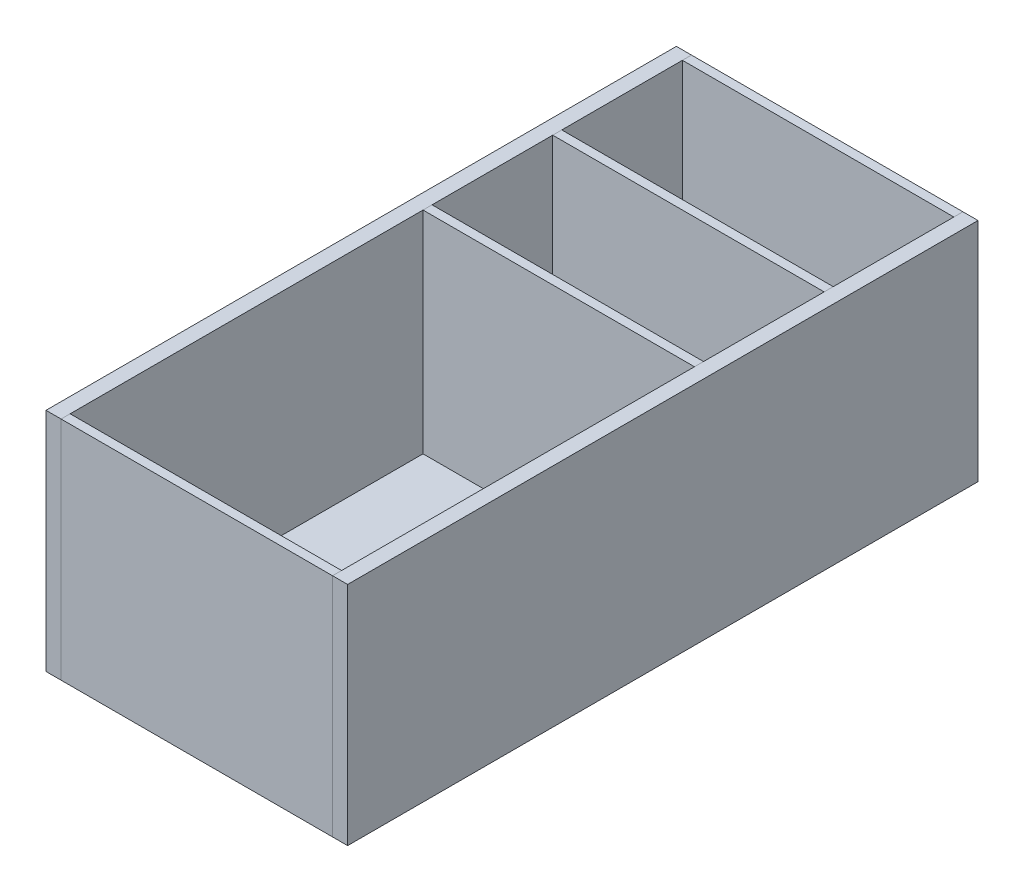
ISO-10303-21;
HEADER;
FILE_DESCRIPTION(('STEP AP214'),'2;1');
FILE_NAME('part.step','',(''),(''),'','','');
FILE_SCHEMA(('AUTOMOTIVE_DESIGN { 1 0 10303 214 1 1 1 1 }'));
ENDSEC;
DATA;
#1=APPLICATION_CONTEXT('core data for automotive mechanical design processes');
#2=APPLICATION_PROTOCOL_DEFINITION('international standard','automotive_design',2000,#1);
#3=PRODUCT_CONTEXT('',#1,'mechanical');
#4=PRODUCT('Part','Part','',(#3));
#5=PRODUCT_RELATED_PRODUCT_CATEGORY('part','',(#4));
#6=PRODUCT_DEFINITION_FORMATION('','',#4);
#7=PRODUCT_DEFINITION_CONTEXT('part definition',#1,'design');
#8=PRODUCT_DEFINITION('design','',#6,#7);
#9=PRODUCT_DEFINITION_SHAPE('','',#8);
#10=(LENGTH_UNIT() NAMED_UNIT(*) SI_UNIT(.MILLI.,.METRE.));
#11=(NAMED_UNIT(*) PLANE_ANGLE_UNIT() SI_UNIT($,.RADIAN.));
#12=(NAMED_UNIT(*) SI_UNIT($,.STERADIAN.) SOLID_ANGLE_UNIT());
#13=UNCERTAINTY_MEASURE_WITH_UNIT(LENGTH_MEASURE(1.E-05),#10,'distance_accuracy_value','');
#14=(GEOMETRIC_REPRESENTATION_CONTEXT(3) GLOBAL_UNCERTAINTY_ASSIGNED_CONTEXT((#13)) GLOBAL_UNIT_ASSIGNED_CONTEXT((#10,
#11,#12)) REPRESENTATION_CONTEXT('',''));
#15=CARTESIAN_POINT('',(0.,0.,0.));
#16=DIRECTION('',(0.,0.,1.));
#17=DIRECTION('',(1.,0.,0.));
#18=AXIS2_PLACEMENT_3D('',#15,#16,#17);
#19=CARTESIAN_POINT('',(-45.,0.,0.));
#20=DIRECTION('',(1.,0.,0.));
#21=DIRECTION('',(0.,0.,-1.));
#22=AXIS2_PLACEMENT_3D('',#19,#20,#21);
#23=PLANE('',#22);
#24=DIRECTION('',(0.,0.,-1.));
#25=VECTOR('',#24,1.);
#26=CARTESIAN_POINT('',(-45.,35.,288.));
#27=LINE('',#26,#25);
#28=CARTESIAN_POINT('',(-45.,35.,166.));
#29=VERTEX_POINT('',#28);
#30=CARTESIAN_POINT('',(-45.,35.,-43.));
#31=VERTEX_POINT('',#30);
#32=EDGE_CURVE('E104',#29,#31,#27,.T.);
#33=ORIENTED_EDGE('',*,*,#32,.F.);
#34=DIRECTION('',(0.,1.,0.));
#35=VECTOR('',#34,1.);
#36=CARTESIAN_POINT('',(-45.,0.,166.));
#37=LINE('',#36,#35);
#38=CARTESIAN_POINT('',(-45.,-40.,166.));
#39=VERTEX_POINT('',#38);
#40=EDGE_CURVE('E63',#39,#29,#37,.T.);
#41=ORIENTED_EDGE('',*,*,#40,.F.);
#42=DIRECTION('',(0.,0.,1.));
#43=VECTOR('',#42,1.);
#44=CARTESIAN_POINT('',(-45.,-40.,288.));
#45=LINE('',#44,#43);
#46=CARTESIAN_POINT('',(-45.,-40.,-43.));
#47=VERTEX_POINT('',#46);
#48=EDGE_CURVE('E115',#47,#39,#45,.T.);
#49=ORIENTED_EDGE('',*,*,#48,.F.);
#50=DIRECTION('',(0.,-1.,0.));
#51=VECTOR('',#50,1.);
#52=CARTESIAN_POINT('',(-45.,0.,-43.));
#53=LINE('',#52,#51);
#54=EDGE_CURVE('E113',#31,#47,#53,.T.);
#55=ORIENTED_EDGE('',*,*,#54,.F.);
#56=EDGE_LOOP('',(#33,#41,#49,#55));
#57=FACE_BOUND('',#56,.T.);
#58=ADVANCED_FACE('F59',(#57),#23,.T.);
#59=CARTESIAN_POINT('',(-50.,0.,288.));
#60=DIRECTION('',(-1.,0.,0.));
#61=DIRECTION('',(0.,0.,1.));
#62=AXIS2_PLACEMENT_3D('',#59,#60,#61);
#63=PLANE('',#62);
#64=DIRECTION('',(0.,0.,-1.));
#65=VECTOR('',#64,1.);
#66=CARTESIAN_POINT('',(-50.,-40.,288.));
#67=LINE('',#66,#65);
#68=CARTESIAN_POINT('',(-50.,-40.,166.));
#69=VERTEX_POINT('',#68);
#70=CARTESIAN_POINT('',(-50.,-40.,-43.));
#71=VERTEX_POINT('',#70);
#72=EDGE_CURVE('E76',#69,#71,#67,.T.);
#73=ORIENTED_EDGE('',*,*,#72,.F.);
#74=DIRECTION('',(0.,-1.,0.));
#75=VECTOR('',#74,1.);
#76=CARTESIAN_POINT('',(-50.,35.,166.));
#77=LINE('',#76,#75);
#78=CARTESIAN_POINT('',(-50.,35.,166.));
#79=VERTEX_POINT('',#78);
#80=EDGE_CURVE('E13',#79,#69,#77,.T.);
#81=ORIENTED_EDGE('',*,*,#80,.F.);
#82=DIRECTION('',(0.,0.,-1.));
#83=VECTOR('',#82,1.);
#84=CARTESIAN_POINT('',(-50.,35.,288.));
#85=LINE('',#84,#83);
#86=CARTESIAN_POINT('',(-50.,35.,-43.));
#87=VERTEX_POINT('',#86);
#88=EDGE_CURVE('E110',#79,#87,#85,.T.);
#89=ORIENTED_EDGE('',*,*,#88,.T.);
#90=DIRECTION('',(0.,1.,0.));
#91=VECTOR('',#90,1.);
#92=CARTESIAN_POINT('',(-50.,35.,-43.));
#93=LINE('',#92,#91);
#94=EDGE_CURVE('E119',#71,#87,#93,.T.);
#95=ORIENTED_EDGE('',*,*,#94,.F.);
#96=EDGE_LOOP('',(#73,#81,#89,#95));
#97=FACE_BOUND('',#96,.T.);
#98=ADVANCED_FACE('F133',(#97),#63,.T.);
#99=CARTESIAN_POINT('',(0.,35.,288.));
#100=DIRECTION('',(0.,1.,0.));
#101=DIRECTION('',(0.,0.,1.));
#102=AXIS2_PLACEMENT_3D('',#99,#100,#101);
#103=PLANE('',#102);
#104=DIRECTION('',(-1.,0.,0.));
#105=VECTOR('',#104,1.);
#106=CARTESIAN_POINT('',(-50.,35.,166.));
#107=LINE('',#106,#105);
#108=EDGE_CURVE('E83',#29,#79,#107,.T.);
#109=ORIENTED_EDGE('',*,*,#108,.F.);
#110=ORIENTED_EDGE('',*,*,#32,.T.);
#111=DIRECTION('',(1.,0.,0.));
#112=VECTOR('',#111,1.);
#113=CARTESIAN_POINT('',(50.,35.,-43.));
#114=LINE('',#113,#112);
#115=EDGE_CURVE('E108',#87,#31,#114,.T.);
#116=ORIENTED_EDGE('',*,*,#115,.F.);
#117=ORIENTED_EDGE('',*,*,#88,.F.);
#118=EDGE_LOOP('',(#109,#110,#116,#117));
#119=FACE_BOUND('',#118,.T.);
#120=ADVANCED_FACE('F106',(#119),#103,.T.);
#121=CARTESIAN_POINT('',(0.,-40.,288.));
#122=DIRECTION('',(0.,-1.,0.));
#123=DIRECTION('',(0.,0.,-1.));
#124=AXIS2_PLACEMENT_3D('',#121,#122,#123);
#125=PLANE('',#124);
#126=DIRECTION('',(-1.,0.,0.));
#127=VECTOR('',#126,1.);
#128=CARTESIAN_POINT('',(50.,-40.,-43.));
#129=LINE('',#128,#127);
#130=EDGE_CURVE('E121',#47,#71,#129,.T.);
#131=ORIENTED_EDGE('',*,*,#130,.F.);
#132=ORIENTED_EDGE('',*,*,#48,.T.);
#133=DIRECTION('',(1.,0.,0.));
#134=VECTOR('',#133,1.);
#135=CARTESIAN_POINT('',(-50.,-40.,166.));
#136=LINE('',#135,#134);
#137=EDGE_CURVE('E68',#69,#39,#136,.T.);
#138=ORIENTED_EDGE('',*,*,#137,.F.);
#139=ORIENTED_EDGE('',*,*,#72,.T.);
#140=EDGE_LOOP('',(#131,#132,#138,#139));
#141=FACE_BOUND('',#140,.T.);
#142=ADVANCED_FACE('F128',(#141),#125,.T.);
#143=CARTESIAN_POINT('',(0.,0.,166.));
#144=DIRECTION('',(0.,0.,1.));
#145=DIRECTION('',(1.,0.,0.));
#146=AXIS2_PLACEMENT_3D('',#143,#144,#145);
#147=PLANE('',#146);
#148=ORIENTED_EDGE('',*,*,#137,.T.);
#149=ORIENTED_EDGE('',*,*,#40,.T.);
#150=ORIENTED_EDGE('',*,*,#108,.T.);
#151=ORIENTED_EDGE('',*,*,#80,.T.);
#152=EDGE_LOOP('',(#148,#149,#150,#151));
#153=FACE_BOUND('',#152,.T.);
#154=ADVANCED_FACE('F129',(#153),#147,.T.);
#155=CARTESIAN_POINT('',(0.,0.,-43.));
#156=DIRECTION('',(0.,0.,-1.));
#157=DIRECTION('',(-1.,0.,0.));
#158=AXIS2_PLACEMENT_3D('',#155,#156,#157);
#159=PLANE('',#158);
#160=ORIENTED_EDGE('',*,*,#115,.T.);
#161=ORIENTED_EDGE('',*,*,#54,.T.);
#162=ORIENTED_EDGE('',*,*,#130,.T.);
#163=ORIENTED_EDGE('',*,*,#94,.T.);
#164=EDGE_LOOP('',(#160,#161,#162,#163));
#165=FACE_BOUND('',#164,.T.);
#166=ADVANCED_FACE('F61',(#165),#159,.T.);
#167=CLOSED_SHELL('',(#58,#98,#120,#142,#154,#166));
#168=MANIFOLD_SOLID_BREP('B2',#167);
#169=CARTESIAN_POINT('',(-45.,0.,0.));
#170=DIRECTION('',(1.,0.,0.));
#171=DIRECTION('',(0.,0.,-1.));
#172=AXIS2_PLACEMENT_3D('',#169,#170,#171);
#173=PLANE('',#172);
#174=DIRECTION('',(0.,0.,-1.));
#175=VECTOR('',#174,1.);
#176=CARTESIAN_POINT('',(-45.,35.,288.));
#177=LINE('',#176,#175);
#178=CARTESIAN_POINT('',(-45.,35.,166.));
#179=VERTEX_POINT('',#178);
#180=CARTESIAN_POINT('',(-45.,35.,163.));
#181=VERTEX_POINT('',#180);
#182=EDGE_CURVE('E414',#179,#181,#177,.T.);
#183=ORIENTED_EDGE('',*,*,#182,.T.);
#184=DIRECTION('',(0.,1.,0.));
#185=VECTOR('',#184,1.);
#186=CARTESIAN_POINT('',(-45.,0.,163.));
#187=LINE('',#186,#185);
#188=CARTESIAN_POINT('',(-45.,-35.,163.));
#189=VERTEX_POINT('',#188);
#190=EDGE_CURVE('E238',#189,#181,#187,.T.);
#191=ORIENTED_EDGE('',*,*,#190,.F.);
#192=DIRECTION('',(0.,0.,-1.));
#193=VECTOR('',#192,1.);
#194=CARTESIAN_POINT('',(-45.,-35.,288.));
#195=LINE('',#194,#193);
#196=CARTESIAN_POINT('',(-45.,-35.,46.));
#197=VERTEX_POINT('',#196);
#198=EDGE_CURVE('E399',#189,#197,#195,.T.);
#199=ORIENTED_EDGE('',*,*,#198,.T.);
#200=DIRECTION('',(0.,-1.,0.));
#201=VECTOR('',#200,1.);
#202=CARTESIAN_POINT('',(-45.,35.,46.));
#203=LINE('',#202,#201);
#204=CARTESIAN_POINT('',(-45.,35.,46.));
#205=VERTEX_POINT('',#204);
#206=EDGE_CURVE('E372',#205,#197,#203,.T.);
#207=ORIENTED_EDGE('',*,*,#206,.F.);
#208=CARTESIAN_POINT('',(-45.,35.,43.));
#209=VERTEX_POINT('',#208);
#210=EDGE_CURVE('E475',#205,#209,#177,.T.);
#211=ORIENTED_EDGE('',*,*,#210,.T.);
#212=DIRECTION('',(0.,-1.,0.));
#213=VECTOR('',#212,1.);
#214=CARTESIAN_POINT('',(-45.,35.,43.));
#215=LINE('',#214,#213);
#216=CARTESIAN_POINT('',(-45.,-35.,43.));
#217=VERTEX_POINT('',#216);
#218=EDGE_CURVE('E225',#209,#217,#215,.T.);
#219=ORIENTED_EDGE('',*,*,#218,.T.);
#220=CARTESIAN_POINT('',(-45.,-35.,3.));
#221=VERTEX_POINT('',#220);
#222=EDGE_CURVE('E421',#217,#221,#195,.T.);
#223=ORIENTED_EDGE('',*,*,#222,.T.);
#224=DIRECTION('',(0.,1.,0.));
#225=VECTOR('',#224,1.);
#226=CARTESIAN_POINT('',(-45.,0.,3.));
#227=LINE('',#226,#225);
#228=CARTESIAN_POINT('',(-45.,35.,3.));
#229=VERTEX_POINT('',#228);
#230=EDGE_CURVE('E405',#221,#229,#227,.T.);
#231=ORIENTED_EDGE('',*,*,#230,.T.);
#232=CARTESIAN_POINT('',(-45.,35.,0.));
#233=VERTEX_POINT('',#232);
#234=EDGE_CURVE('E413',#229,#233,#177,.T.);
#235=ORIENTED_EDGE('',*,*,#234,.T.);
#236=DIRECTION('',(0.,1.,0.));
#237=VECTOR('',#236,1.);
#238=CARTESIAN_POINT('',(-45.,0.,0.));
#239=LINE('',#238,#237);
#240=CARTESIAN_POINT('',(-45.,-35.,0.));
#241=VERTEX_POINT('',#240);
#242=EDGE_CURVE('E446',#241,#233,#239,.T.);
#243=ORIENTED_EDGE('',*,*,#242,.F.);
#244=CARTESIAN_POINT('',(-45.,-35.,-40.));
#245=VERTEX_POINT('',#244);
#246=EDGE_CURVE('E401',#241,#245,#195,.T.);
#247=ORIENTED_EDGE('',*,*,#246,.T.);
#248=DIRECTION('',(0.,-1.,0.));
#249=VECTOR('',#248,1.);
#250=CARTESIAN_POINT('',(-45.,0.,-40.));
#251=LINE('',#250,#249);
#252=CARTESIAN_POINT('',(-45.,35.,-40.));
#253=VERTEX_POINT('',#252);
#254=EDGE_CURVE('E439',#253,#245,#251,.T.);
#255=ORIENTED_EDGE('',*,*,#254,.F.);
#256=CARTESIAN_POINT('',(-45.,35.,-43.));
#257=VERTEX_POINT('',#256);
#258=EDGE_CURVE('E246',#253,#257,#177,.T.);
#259=ORIENTED_EDGE('',*,*,#258,.T.);
#260=DIRECTION('',(0.,-1.,0.));
#261=VECTOR('',#260,1.);
#262=CARTESIAN_POINT('',(-45.,0.,-43.));
#263=LINE('',#262,#261);
#264=CARTESIAN_POINT('',(-45.,-40.,-43.));
#265=VERTEX_POINT('',#264);
#266=EDGE_CURVE('E393',#257,#265,#263,.T.);
#267=ORIENTED_EDGE('',*,*,#266,.T.);
#268=DIRECTION('',(0.,0.,1.));
#269=VECTOR('',#268,1.);
#270=CARTESIAN_POINT('',(-45.,-40.,288.));
#271=LINE('',#270,#269);
#272=CARTESIAN_POINT('',(-45.,-40.,166.));
#273=VERTEX_POINT('',#272);
#274=EDGE_CURVE('E390',#265,#273,#271,.T.);
#275=ORIENTED_EDGE('',*,*,#274,.T.);
#276=DIRECTION('',(0.,1.,0.));
#277=VECTOR('',#276,1.);
#278=CARTESIAN_POINT('',(-45.,0.,166.));
#279=LINE('',#278,#277);
#280=EDGE_CURVE('E395',#273,#179,#279,.T.);
#281=ORIENTED_EDGE('',*,*,#280,.T.);
#282=EDGE_LOOP('',(#183,#191,#199,#207,#211,#219,#223,#231,#235,#243,#247,#255,#259,#267,#275,#281));
#283=FACE_BOUND('',#282,.T.);
#284=ADVANCED_FACE('F221',(#283),#173,.F.);
#285=CARTESIAN_POINT('',(45.,0.,0.));
#286=DIRECTION('',(-1.,0.,0.));
#287=DIRECTION('',(0.,0.,1.));
#288=AXIS2_PLACEMENT_3D('',#285,#286,#287);
#289=PLANE('',#288);
#290=DIRECTION('',(0.,0.,1.));
#291=VECTOR('',#290,1.);
#292=CARTESIAN_POINT('',(45.,35.,288.));
#293=LINE('',#292,#291);
#294=CARTESIAN_POINT('',(45.,35.,43.));
#295=VERTEX_POINT('',#294);
#296=CARTESIAN_POINT('',(45.,35.,46.));
#297=VERTEX_POINT('',#296);
#298=EDGE_CURVE('E389',#295,#297,#293,.T.);
#299=ORIENTED_EDGE('',*,*,#298,.T.);
#300=DIRECTION('',(0.,1.,0.));
#301=VECTOR('',#300,1.);
#302=CARTESIAN_POINT('',(45.,35.,46.));
#303=LINE('',#302,#301);
#304=CARTESIAN_POINT('',(45.,-35.,46.));
#305=VERTEX_POINT('',#304);
#306=EDGE_CURVE('E375',#305,#297,#303,.T.);
#307=ORIENTED_EDGE('',*,*,#306,.F.);
#308=DIRECTION('',(0.,0.,-1.));
#309=VECTOR('',#308,1.);
#310=CARTESIAN_POINT('',(45.,-35.,288.));
#311=LINE('',#310,#309);
#312=CARTESIAN_POINT('',(45.,-35.,163.));
#313=VERTEX_POINT('',#312);
#314=EDGE_CURVE('E383',#313,#305,#311,.T.);
#315=ORIENTED_EDGE('',*,*,#314,.F.);
#316=DIRECTION('',(0.,1.,0.));
#317=VECTOR('',#316,1.);
#318=CARTESIAN_POINT('',(45.,0.,163.));
#319=LINE('',#318,#317);
#320=CARTESIAN_POINT('',(45.,35.,163.));
#321=VERTEX_POINT('',#320);
#322=EDGE_CURVE('E349',#313,#321,#319,.T.);
#323=ORIENTED_EDGE('',*,*,#322,.T.);
#324=CARTESIAN_POINT('',(45.,35.,166.));
#325=VERTEX_POINT('',#324);
#326=EDGE_CURVE('E361',#321,#325,#293,.T.);
#327=ORIENTED_EDGE('',*,*,#326,.T.);
#328=DIRECTION('',(0.,-1.,0.));
#329=VECTOR('',#328,1.);
#330=CARTESIAN_POINT('',(45.,0.,166.));
#331=LINE('',#330,#329);
#332=CARTESIAN_POINT('',(45.,-40.,166.));
#333=VERTEX_POINT('',#332);
#334=EDGE_CURVE('E396',#325,#333,#331,.T.);
#335=ORIENTED_EDGE('',*,*,#334,.T.);
#336=DIRECTION('',(0.,0.,-1.));
#337=VECTOR('',#336,1.);
#338=CARTESIAN_POINT('',(45.,-40.,288.));
#339=LINE('',#338,#337);
#340=CARTESIAN_POINT('',(45.,-40.,-43.));
#341=VERTEX_POINT('',#340);
#342=EDGE_CURVE('E391',#333,#341,#339,.T.);
#343=ORIENTED_EDGE('',*,*,#342,.T.);
#344=DIRECTION('',(0.,1.,0.));
#345=VECTOR('',#344,1.);
#346=CARTESIAN_POINT('',(45.,0.,-43.));
#347=LINE('',#346,#345);
#348=CARTESIAN_POINT('',(45.,35.,-43.));
#349=VERTEX_POINT('',#348);
#350=EDGE_CURVE('E357',#341,#349,#347,.T.);
#351=ORIENTED_EDGE('',*,*,#350,.T.);
#352=CARTESIAN_POINT('',(45.,35.,-40.));
#353=VERTEX_POINT('',#352);
#354=EDGE_CURVE('E353',#349,#353,#293,.T.);
#355=ORIENTED_EDGE('',*,*,#354,.T.);
#356=DIRECTION('',(0.,-1.,0.));
#357=VECTOR('',#356,1.);
#358=CARTESIAN_POINT('',(45.,0.,-40.));
#359=LINE('',#358,#357);
#360=CARTESIAN_POINT('',(45.,-35.,-40.));
#361=VERTEX_POINT('',#360);
#362=EDGE_CURVE('E341',#353,#361,#359,.T.);
#363=ORIENTED_EDGE('',*,*,#362,.T.);
#364=CARTESIAN_POINT('',(45.,-35.,0.));
#365=VERTEX_POINT('',#364);
#366=EDGE_CURVE('E386',#365,#361,#311,.T.);
#367=ORIENTED_EDGE('',*,*,#366,.F.);
#368=DIRECTION('',(0.,1.,0.));
#369=VECTOR('',#368,1.);
#370=CARTESIAN_POINT('',(45.,0.,0.));
#371=LINE('',#370,#369);
#372=CARTESIAN_POINT('',(45.,35.,0.));
#373=VERTEX_POINT('',#372);
#374=EDGE_CURVE('E350',#365,#373,#371,.T.);
#375=ORIENTED_EDGE('',*,*,#374,.T.);
#376=CARTESIAN_POINT('',(45.,35.,3.));
#377=VERTEX_POINT('',#376);
#378=EDGE_CURVE('E359',#373,#377,#293,.T.);
#379=ORIENTED_EDGE('',*,*,#378,.T.);
#380=DIRECTION('',(0.,1.,0.));
#381=VECTOR('',#380,1.);
#382=CARTESIAN_POINT('',(45.,0.,3.));
#383=LINE('',#382,#381);
#384=CARTESIAN_POINT('',(45.,-35.,3.));
#385=VERTEX_POINT('',#384);
#386=EDGE_CURVE('E379',#385,#377,#383,.T.);
#387=ORIENTED_EDGE('',*,*,#386,.F.);
#388=CARTESIAN_POINT('',(45.,-35.,43.));
#389=VERTEX_POINT('',#388);
#390=EDGE_CURVE('E384',#389,#385,#311,.T.);
#391=ORIENTED_EDGE('',*,*,#390,.F.);
#392=DIRECTION('',(0.,1.,0.));
#393=VECTOR('',#392,1.);
#394=CARTESIAN_POINT('',(45.,35.,43.));
#395=LINE('',#394,#393);
#396=EDGE_CURVE('E406',#389,#295,#395,.T.);
#397=ORIENTED_EDGE('',*,*,#396,.T.);
#398=EDGE_LOOP('',(#299,#307,#315,#323,#327,#335,#343,#351,#355,#363,#367,#375,#379,#387,#391,#397));
#399=FACE_BOUND('',#398,.T.);
#400=ADVANCED_FACE('F355',(#399),#289,.F.);
#401=CARTESIAN_POINT('',(0.,35.,288.));
#402=DIRECTION('',(0.,1.,0.));
#403=DIRECTION('',(0.,0.,1.));
#404=AXIS2_PLACEMENT_3D('',#401,#402,#403);
#405=PLANE('',#404);
#406=ORIENTED_EDGE('',*,*,#234,.F.);
#407=DIRECTION('',(-1.,0.,0.));
#408=VECTOR('',#407,1.);
#409=CARTESIAN_POINT('',(0.,35.,3.));
#410=LINE('',#409,#408);
#411=EDGE_CURVE('E382',#377,#229,#410,.T.);
#412=ORIENTED_EDGE('',*,*,#411,.F.);
#413=ORIENTED_EDGE('',*,*,#378,.F.);
#414=DIRECTION('',(-1.,0.,0.));
#415=VECTOR('',#414,1.);
#416=CARTESIAN_POINT('',(0.,35.,0.));
#417=LINE('',#416,#415);
#418=EDGE_CURVE('E445',#373,#233,#417,.T.);
#419=ORIENTED_EDGE('',*,*,#418,.T.);
#420=EDGE_LOOP('',(#406,#412,#413,#419));
#421=FACE_BOUND('',#420,.T.);
#422=ADVANCED_FACE('F485',(#421),#405,.T.);
#423=CARTESIAN_POINT('',(0.,-35.,288.));
#424=DIRECTION('',(0.,-1.,0.));
#425=DIRECTION('',(0.,0.,-1.));
#426=AXIS2_PLACEMENT_3D('',#423,#424,#425);
#427=PLANE('',#426);
#428=DIRECTION('',(1.,0.,0.));
#429=VECTOR('',#428,1.);
#430=CARTESIAN_POINT('',(-45.,-35.,43.));
#431=LINE('',#430,#429);
#432=EDGE_CURVE('E411',#217,#389,#431,.T.);
#433=ORIENTED_EDGE('',*,*,#432,.T.);
#434=ORIENTED_EDGE('',*,*,#390,.T.);
#435=DIRECTION('',(-1.,0.,0.));
#436=VECTOR('',#435,1.);
#437=CARTESIAN_POINT('',(0.,-35.,3.));
#438=LINE('',#437,#436);
#439=EDGE_CURVE('E443',#385,#221,#438,.T.);
#440=ORIENTED_EDGE('',*,*,#439,.T.);
#441=ORIENTED_EDGE('',*,*,#222,.F.);
#442=EDGE_LOOP('',(#433,#434,#440,#441));
#443=FACE_BOUND('',#442,.T.);
#444=ADVANCED_FACE('F482',(#443),#427,.F.);
#445=ORIENTED_EDGE('',*,*,#210,.F.);
#446=DIRECTION('',(-1.,0.,0.));
#447=VECTOR('',#446,1.);
#448=CARTESIAN_POINT('',(-45.,35.,46.));
#449=LINE('',#448,#447);
#450=EDGE_CURVE('E378',#297,#205,#449,.T.);
#451=ORIENTED_EDGE('',*,*,#450,.F.);
#452=ORIENTED_EDGE('',*,*,#298,.F.);
#453=DIRECTION('',(-1.,0.,0.));
#454=VECTOR('',#453,1.);
#455=CARTESIAN_POINT('',(-45.,35.,43.));
#456=LINE('',#455,#454);
#457=EDGE_CURVE('E451',#295,#209,#456,.T.);
#458=ORIENTED_EDGE('',*,*,#457,.T.);
#459=EDGE_LOOP('',(#445,#451,#452,#458));
#460=FACE_BOUND('',#459,.T.);
#461=ADVANCED_FACE('F474',(#460),#405,.T.);
#462=CARTESIAN_POINT('',(0.,0.,43.));
#463=DIRECTION('',(0.,0.,1.));
#464=DIRECTION('',(1.,0.,0.));
#465=AXIS2_PLACEMENT_3D('',#462,#463,#464);
#466=PLANE('',#465);
#467=ORIENTED_EDGE('',*,*,#218,.F.);
#468=ORIENTED_EDGE('',*,*,#457,.F.);
#469=ORIENTED_EDGE('',*,*,#396,.F.);
#470=ORIENTED_EDGE('',*,*,#432,.F.);
#471=EDGE_LOOP('',(#467,#468,#469,#470));
#472=FACE_BOUND('',#471,.T.);
#473=ADVANCED_FACE('F491',(#472),#466,.F.);
#474=DIRECTION('',(-1.,0.,0.));
#475=VECTOR('',#474,1.);
#476=CARTESIAN_POINT('',(0.,-35.,0.));
#477=LINE('',#476,#475);
#478=EDGE_CURVE('E381',#365,#241,#477,.T.);
#479=ORIENTED_EDGE('',*,*,#478,.F.);
#480=ORIENTED_EDGE('',*,*,#366,.T.);
#481=DIRECTION('',(1.,0.,0.));
#482=VECTOR('',#481,1.);
#483=CARTESIAN_POINT('',(0.,-35.,-40.));
#484=LINE('',#483,#482);
#485=EDGE_CURVE('E346',#245,#361,#484,.T.);
#486=ORIENTED_EDGE('',*,*,#485,.F.);
#487=ORIENTED_EDGE('',*,*,#246,.F.);
#488=EDGE_LOOP('',(#479,#480,#486,#487));
#489=FACE_BOUND('',#488,.T.);
#490=ADVANCED_FACE('F488',(#489),#427,.F.);
#491=ORIENTED_EDGE('',*,*,#182,.F.);
#492=DIRECTION('',(-1.,0.,0.));
#493=VECTOR('',#492,1.);
#494=CARTESIAN_POINT('',(-50.,35.,166.));
#495=LINE('',#494,#493);
#496=EDGE_CURVE('E363',#325,#179,#495,.T.);
#497=ORIENTED_EDGE('',*,*,#496,.F.);
#498=ORIENTED_EDGE('',*,*,#326,.F.);
#499=DIRECTION('',(-1.,0.,0.));
#500=VECTOR('',#499,1.);
#501=CARTESIAN_POINT('',(-50.,35.,163.));
#502=LINE('',#501,#500);
#503=EDGE_CURVE('E57',#321,#181,#502,.T.);
#504=ORIENTED_EDGE('',*,*,#503,.T.);
#505=EDGE_LOOP('',(#491,#497,#498,#504));
#506=FACE_BOUND('',#505,.T.);
#507=ADVANCED_FACE('F490',(#506),#405,.T.);
#508=ORIENTED_EDGE('',*,*,#314,.T.);
#509=DIRECTION('',(1.,0.,0.));
#510=VECTOR('',#509,1.);
#511=CARTESIAN_POINT('',(-45.,-35.,46.));
#512=LINE('',#511,#510);
#513=EDGE_CURVE('E377',#197,#305,#512,.T.);
#514=ORIENTED_EDGE('',*,*,#513,.F.);
#515=ORIENTED_EDGE('',*,*,#198,.F.);
#516=DIRECTION('',(-1.,0.,0.));
#517=VECTOR('',#516,1.);
#518=CARTESIAN_POINT('',(0.,-35.,163.));
#519=LINE('',#518,#517);
#520=EDGE_CURVE('E385',#313,#189,#519,.T.);
#521=ORIENTED_EDGE('',*,*,#520,.F.);
#522=EDGE_LOOP('',(#508,#514,#515,#521));
#523=FACE_BOUND('',#522,.T.);
#524=ADVANCED_FACE('F467',(#523),#427,.F.);
#525=CARTESIAN_POINT('',(0.,0.,163.));
#526=DIRECTION('',(0.,0.,1.));
#527=DIRECTION('',(1.,0.,0.));
#528=AXIS2_PLACEMENT_3D('',#525,#526,#527);
#529=PLANE('',#528);
#530=ORIENTED_EDGE('',*,*,#322,.F.);
#531=ORIENTED_EDGE('',*,*,#520,.T.);
#532=ORIENTED_EDGE('',*,*,#190,.T.);
#533=ORIENTED_EDGE('',*,*,#503,.F.);
#534=EDGE_LOOP('',(#530,#531,#532,#533));
#535=FACE_BOUND('',#534,.T.);
#536=ADVANCED_FACE('F504',(#535),#529,.F.);
#537=CARTESIAN_POINT('',(0.,-40.,288.));
#538=DIRECTION('',(0.,-1.,0.));
#539=DIRECTION('',(0.,0.,-1.));
#540=AXIS2_PLACEMENT_3D('',#537,#538,#539);
#541=PLANE('',#540);
#542=ORIENTED_EDGE('',*,*,#274,.F.);
#543=DIRECTION('',(-1.,0.,0.));
#544=VECTOR('',#543,1.);
#545=CARTESIAN_POINT('',(50.,-40.,-43.));
#546=LINE('',#545,#544);
#547=EDGE_CURVE('E364',#341,#265,#546,.T.);
#548=ORIENTED_EDGE('',*,*,#547,.F.);
#549=ORIENTED_EDGE('',*,*,#342,.F.);
#550=DIRECTION('',(1.,0.,0.));
#551=VECTOR('',#550,1.);
#552=CARTESIAN_POINT('',(-50.,-40.,166.));
#553=LINE('',#552,#551);
#554=EDGE_CURVE('E230',#273,#333,#553,.T.);
#555=ORIENTED_EDGE('',*,*,#554,.F.);
#556=EDGE_LOOP('',(#542,#548,#549,#555));
#557=FACE_BOUND('',#556,.T.);
#558=ADVANCED_FACE('F526',(#557),#541,.T.);
#559=CARTESIAN_POINT('',(0.,0.,166.));
#560=DIRECTION('',(0.,0.,1.));
#561=DIRECTION('',(1.,0.,0.));
#562=AXIS2_PLACEMENT_3D('',#559,#560,#561);
#563=PLANE('',#562);
#564=ORIENTED_EDGE('',*,*,#280,.F.);
#565=ORIENTED_EDGE('',*,*,#554,.T.);
#566=ORIENTED_EDGE('',*,*,#334,.F.);
#567=ORIENTED_EDGE('',*,*,#496,.T.);
#568=EDGE_LOOP('',(#564,#565,#566,#567));
#569=FACE_BOUND('',#568,.T.);
#570=ADVANCED_FACE('F530',(#569),#563,.T.);
#571=ORIENTED_EDGE('',*,*,#258,.F.);
#572=DIRECTION('',(1.,0.,0.));
#573=VECTOR('',#572,1.);
#574=CARTESIAN_POINT('',(50.,35.,-40.));
#575=LINE('',#574,#573);
#576=EDGE_CURVE('E344',#253,#353,#575,.T.);
#577=ORIENTED_EDGE('',*,*,#576,.T.);
#578=ORIENTED_EDGE('',*,*,#354,.F.);
#579=DIRECTION('',(1.,0.,0.));
#580=VECTOR('',#579,1.);
#581=CARTESIAN_POINT('',(50.,35.,-43.));
#582=LINE('',#581,#580);
#583=EDGE_CURVE('E369',#257,#349,#582,.T.);
#584=ORIENTED_EDGE('',*,*,#583,.F.);
#585=EDGE_LOOP('',(#571,#577,#578,#584));
#586=FACE_BOUND('',#585,.T.);
#587=ADVANCED_FACE('F362',(#586),#405,.T.);
#588=CARTESIAN_POINT('',(0.,0.,-43.));
#589=DIRECTION('',(0.,0.,-1.));
#590=DIRECTION('',(-1.,0.,0.));
#591=AXIS2_PLACEMENT_3D('',#588,#589,#590);
#592=PLANE('',#591);
#593=ORIENTED_EDGE('',*,*,#266,.F.);
#594=ORIENTED_EDGE('',*,*,#583,.T.);
#595=ORIENTED_EDGE('',*,*,#350,.F.);
#596=ORIENTED_EDGE('',*,*,#547,.T.);
#597=EDGE_LOOP('',(#593,#594,#595,#596));
#598=FACE_BOUND('',#597,.T.);
#599=ADVANCED_FACE('F223',(#598),#592,.T.);
#600=CARTESIAN_POINT('',(0.,0.,-40.));
#601=DIRECTION('',(0.,0.,-1.));
#602=DIRECTION('',(-1.,0.,0.));
#603=AXIS2_PLACEMENT_3D('',#600,#601,#602);
#604=PLANE('',#603);
#605=ORIENTED_EDGE('',*,*,#576,.F.);
#606=ORIENTED_EDGE('',*,*,#254,.T.);
#607=ORIENTED_EDGE('',*,*,#485,.T.);
#608=ORIENTED_EDGE('',*,*,#362,.F.);
#609=EDGE_LOOP('',(#605,#606,#607,#608));
#610=FACE_BOUND('',#609,.T.);
#611=ADVANCED_FACE('F343',(#610),#604,.F.);
#612=CARTESIAN_POINT('',(0.,0.,46.));
#613=DIRECTION('',(0.,0.,1.));
#614=DIRECTION('',(1.,0.,0.));
#615=AXIS2_PLACEMENT_3D('',#612,#613,#614);
#616=PLANE('',#615);
#617=ORIENTED_EDGE('',*,*,#206,.T.);
#618=ORIENTED_EDGE('',*,*,#513,.T.);
#619=ORIENTED_EDGE('',*,*,#306,.T.);
#620=ORIENTED_EDGE('',*,*,#450,.T.);
#621=EDGE_LOOP('',(#617,#618,#619,#620));
#622=FACE_BOUND('',#621,.T.);
#623=ADVANCED_FACE('F462',(#622),#616,.T.);
#624=CARTESIAN_POINT('',(0.,0.,3.));
#625=DIRECTION('',(0.,0.,1.));
#626=DIRECTION('',(1.,0.,0.));
#627=AXIS2_PLACEMENT_3D('',#624,#625,#626);
#628=PLANE('',#627);
#629=ORIENTED_EDGE('',*,*,#230,.F.);
#630=ORIENTED_EDGE('',*,*,#439,.F.);
#631=ORIENTED_EDGE('',*,*,#386,.T.);
#632=ORIENTED_EDGE('',*,*,#411,.T.);
#633=EDGE_LOOP('',(#629,#630,#631,#632));
#634=FACE_BOUND('',#633,.T.);
#635=ADVANCED_FACE('F434',(#634),#628,.T.);
#636=CARTESIAN_POINT('',(0.,0.,0.));
#637=DIRECTION('',(0.,0.,1.));
#638=DIRECTION('',(1.,0.,0.));
#639=AXIS2_PLACEMENT_3D('',#636,#637,#638);
#640=PLANE('',#639);
#641=ORIENTED_EDGE('',*,*,#242,.T.);
#642=ORIENTED_EDGE('',*,*,#418,.F.);
#643=ORIENTED_EDGE('',*,*,#374,.F.);
#644=ORIENTED_EDGE('',*,*,#478,.T.);
#645=EDGE_LOOP('',(#641,#642,#643,#644));
#646=FACE_BOUND('',#645,.T.);
#647=ADVANCED_FACE('F487',(#646),#640,.F.);
#648=CLOSED_SHELL('',(#284,#400,#422,#444,#461,#473,#490,#507,#524,#536,#558,#570,#587,#599,
#611,#623,#635,#647));
#649=MANIFOLD_SOLID_BREP('B7',#648);
#650=CARTESIAN_POINT('',(45.,0.,288.));
#651=DIRECTION('',(-1.,0.,0.));
#652=DIRECTION('',(0.,0.,1.));
#653=AXIS2_PLACEMENT_3D('',#650,#651,#652);
#654=PLANE('',#653);
#655=DIRECTION('',(0.,0.,-1.));
#656=VECTOR('',#655,1.);
#657=CARTESIAN_POINT('',(45.,35.,288.));
#658=LINE('',#657,#656);
#659=CARTESIAN_POINT('',(45.,35.,166.));
#660=VERTEX_POINT('',#659);
#661=CARTESIAN_POINT('',(45.,35.,-43.));
#662=VERTEX_POINT('',#661);
#663=EDGE_CURVE('E718',#660,#662,#658,.T.);
#664=ORIENTED_EDGE('',*,*,#663,.T.);
#665=DIRECTION('',(0.,1.,0.));
#666=VECTOR('',#665,1.);
#667=CARTESIAN_POINT('',(45.,0.,-43.));
#668=LINE('',#667,#666);
#669=CARTESIAN_POINT('',(45.,-40.,-43.));
#670=VERTEX_POINT('',#669);
#671=EDGE_CURVE('E707',#670,#662,#668,.T.);
#672=ORIENTED_EDGE('',*,*,#671,.F.);
#673=DIRECTION('',(0.,0.,-1.));
#674=VECTOR('',#673,1.);
#675=CARTESIAN_POINT('',(45.,-40.,288.));
#676=LINE('',#675,#674);
#677=CARTESIAN_POINT('',(45.,-40.,166.));
#678=VERTEX_POINT('',#677);
#679=EDGE_CURVE('E219',#678,#670,#676,.T.);
#680=ORIENTED_EDGE('',*,*,#679,.F.);
#681=DIRECTION('',(0.,-1.,0.));
#682=VECTOR('',#681,1.);
#683=CARTESIAN_POINT('',(45.,0.,166.));
#684=LINE('',#683,#682);
#685=EDGE_CURVE('E748',#660,#678,#684,.T.);
#686=ORIENTED_EDGE('',*,*,#685,.F.);
#687=EDGE_LOOP('',(#664,#672,#680,#686));
#688=FACE_BOUND('',#687,.T.);
#689=ADVANCED_FACE('F703',(#688),#654,.T.);
#690=CARTESIAN_POINT('',(50.,0.,288.));
#691=DIRECTION('',(-1.,0.,0.));
#692=DIRECTION('',(0.,0.,1.));
#693=AXIS2_PLACEMENT_3D('',#690,#691,#692);
#694=PLANE('',#693);
#695=DIRECTION('',(0.,0.,-1.));
#696=VECTOR('',#695,1.);
#697=CARTESIAN_POINT('',(50.,35.,288.));
#698=LINE('',#697,#696);
#699=CARTESIAN_POINT('',(50.,35.,166.));
#700=VERTEX_POINT('',#699);
#701=CARTESIAN_POINT('',(50.,35.,-43.));
#702=VERTEX_POINT('',#701);
#703=EDGE_CURVE('E762',#700,#702,#698,.T.);
#704=ORIENTED_EDGE('',*,*,#703,.F.);
#705=DIRECTION('',(0.,1.,0.));
#706=VECTOR('',#705,1.);
#707=CARTESIAN_POINT('',(50.,35.,166.));
#708=LINE('',#707,#706);
#709=CARTESIAN_POINT('',(50.,-40.,166.));
#710=VERTEX_POINT('',#709);
#711=EDGE_CURVE('E746',#710,#700,#708,.T.);
#712=ORIENTED_EDGE('',*,*,#711,.F.);
#713=DIRECTION('',(0.,0.,-1.));
#714=VECTOR('',#713,1.);
#715=CARTESIAN_POINT('',(50.,-40.,288.));
#716=LINE('',#715,#714);
#717=CARTESIAN_POINT('',(50.,-40.,-43.));
#718=VERTEX_POINT('',#717);
#719=EDGE_CURVE('E752',#710,#718,#716,.T.);
#720=ORIENTED_EDGE('',*,*,#719,.T.);
#721=DIRECTION('',(0.,-1.,0.));
#722=VECTOR('',#721,1.);
#723=CARTESIAN_POINT('',(50.,35.,-43.));
#724=LINE('',#723,#722);
#725=EDGE_CURVE('E765',#702,#718,#724,.T.);
#726=ORIENTED_EDGE('',*,*,#725,.F.);
#727=EDGE_LOOP('',(#704,#712,#720,#726));
#728=FACE_BOUND('',#727,.T.);
#729=ADVANCED_FACE('F760',(#728),#694,.F.);
#730=CARTESIAN_POINT('',(0.,-40.,288.));
#731=DIRECTION('',(0.,-1.,0.));
#732=DIRECTION('',(0.,0.,-1.));
#733=AXIS2_PLACEMENT_3D('',#730,#731,#732);
#734=PLANE('',#733);
#735=DIRECTION('',(1.,0.,0.));
#736=VECTOR('',#735,1.);
#737=CARTESIAN_POINT('',(-50.,-40.,166.));
#738=LINE('',#737,#736);
#739=EDGE_CURVE('E741',#678,#710,#738,.T.);
#740=ORIENTED_EDGE('',*,*,#739,.F.);
#741=ORIENTED_EDGE('',*,*,#679,.T.);
#742=DIRECTION('',(-1.,0.,0.));
#743=VECTOR('',#742,1.);
#744=CARTESIAN_POINT('',(50.,-40.,-43.));
#745=LINE('',#744,#743);
#746=EDGE_CURVE('E755',#718,#670,#745,.T.);
#747=ORIENTED_EDGE('',*,*,#746,.F.);
#748=ORIENTED_EDGE('',*,*,#719,.F.);
#749=EDGE_LOOP('',(#740,#741,#747,#748));
#750=FACE_BOUND('',#749,.T.);
#751=ADVANCED_FACE('F753',(#750),#734,.T.);
#752=CARTESIAN_POINT('',(0.,35.,288.));
#753=DIRECTION('',(0.,1.,0.));
#754=DIRECTION('',(0.,0.,1.));
#755=AXIS2_PLACEMENT_3D('',#752,#753,#754);
#756=PLANE('',#755);
#757=DIRECTION('',(1.,0.,0.));
#758=VECTOR('',#757,1.);
#759=CARTESIAN_POINT('',(50.,35.,-43.));
#760=LINE('',#759,#758);
#761=EDGE_CURVE('E770',#662,#702,#760,.T.);
#762=ORIENTED_EDGE('',*,*,#761,.F.);
#763=ORIENTED_EDGE('',*,*,#663,.F.);
#764=DIRECTION('',(-1.,0.,0.));
#765=VECTOR('',#764,1.);
#766=CARTESIAN_POINT('',(-50.,35.,166.));
#767=LINE('',#766,#765);
#768=EDGE_CURVE('E763',#700,#660,#767,.T.);
#769=ORIENTED_EDGE('',*,*,#768,.F.);
#770=ORIENTED_EDGE('',*,*,#703,.T.);
#771=EDGE_LOOP('',(#762,#763,#769,#770));
#772=FACE_BOUND('',#771,.T.);
#773=ADVANCED_FACE('F705',(#772),#756,.T.);
#774=CARTESIAN_POINT('',(0.,0.,166.));
#775=DIRECTION('',(0.,0.,1.));
#776=DIRECTION('',(1.,0.,0.));
#777=AXIS2_PLACEMENT_3D('',#774,#775,#776);
#778=PLANE('',#777);
#779=ORIENTED_EDGE('',*,*,#768,.T.);
#780=ORIENTED_EDGE('',*,*,#685,.T.);
#781=ORIENTED_EDGE('',*,*,#739,.T.);
#782=ORIENTED_EDGE('',*,*,#711,.T.);
#783=EDGE_LOOP('',(#779,#780,#781,#782));
#784=FACE_BOUND('',#783,.T.);
#785=ADVANCED_FACE('F744',(#784),#778,.T.);
#786=CARTESIAN_POINT('',(0.,0.,-43.));
#787=DIRECTION('',(0.,0.,-1.));
#788=DIRECTION('',(-1.,0.,0.));
#789=AXIS2_PLACEMENT_3D('',#786,#787,#788);
#790=PLANE('',#789);
#791=ORIENTED_EDGE('',*,*,#746,.T.);
#792=ORIENTED_EDGE('',*,*,#671,.T.);
#793=ORIENTED_EDGE('',*,*,#761,.T.);
#794=ORIENTED_EDGE('',*,*,#725,.T.);
#795=EDGE_LOOP('',(#791,#792,#793,#794));
#796=FACE_BOUND('',#795,.T.);
#797=ADVANCED_FACE('F776',(#796),#790,.T.);
#798=CLOSED_SHELL('',(#689,#729,#751,#773,#785,#797));
#799=MANIFOLD_SOLID_BREP('B51_NOT_SHOWN',#798);
#800=ADVANCED_BREP_SHAPE_REPRESENTATION('',(#18,#168,#649,#799),#14);
#801=SHAPE_DEFINITION_REPRESENTATION(#9,#800);
ENDSEC;
END-ISO-10303-21;
